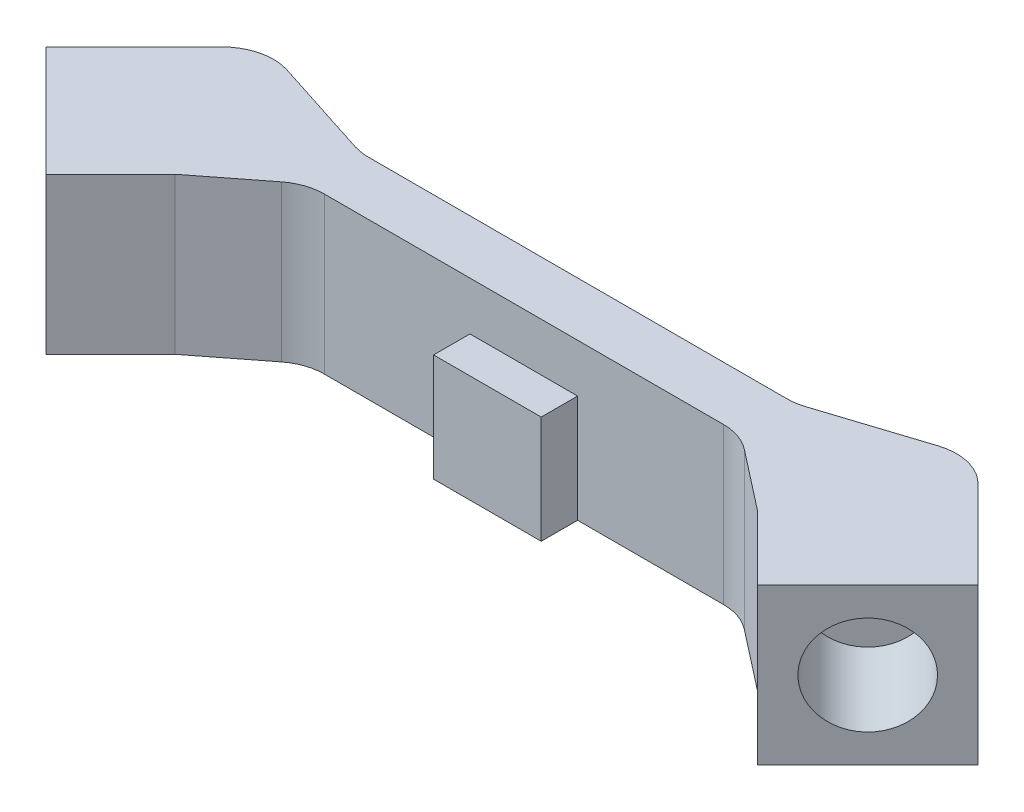
ISO-10303-21;
HEADER;
FILE_DESCRIPTION(('STEP AP214'),'2;1');
FILE_NAME('part.step','',(''),(''),'','','');
FILE_SCHEMA(('AUTOMOTIVE_DESIGN { 1 0 10303 214 1 1 1 1 }'));
ENDSEC;
DATA;
#1=APPLICATION_CONTEXT('core data for automotive mechanical design processes');
#2=APPLICATION_PROTOCOL_DEFINITION('international standard','automotive_design',2000,#1);
#3=PRODUCT_CONTEXT('',#1,'mechanical');
#4=PRODUCT('Part','Part','',(#3));
#5=PRODUCT_RELATED_PRODUCT_CATEGORY('part','',(#4));
#6=PRODUCT_DEFINITION_FORMATION('','',#4);
#7=PRODUCT_DEFINITION_CONTEXT('part definition',#1,'design');
#8=PRODUCT_DEFINITION('design','',#6,#7);
#9=PRODUCT_DEFINITION_SHAPE('','',#8);
#10=(LENGTH_UNIT() NAMED_UNIT(*) SI_UNIT(.MILLI.,.METRE.));
#11=(NAMED_UNIT(*) PLANE_ANGLE_UNIT() SI_UNIT($,.RADIAN.));
#12=(NAMED_UNIT(*) SI_UNIT($,.STERADIAN.) SOLID_ANGLE_UNIT());
#13=UNCERTAINTY_MEASURE_WITH_UNIT(LENGTH_MEASURE(1.E-05),#10,'distance_accuracy_value','');
#14=(GEOMETRIC_REPRESENTATION_CONTEXT(3) GLOBAL_UNCERTAINTY_ASSIGNED_CONTEXT((#13)) GLOBAL_UNIT_ASSIGNED_CONTEXT((#10,
#11,#12)) REPRESENTATION_CONTEXT('',''));
#15=CARTESIAN_POINT('',(0.,0.,0.));
#16=DIRECTION('',(0.,0.,1.));
#17=DIRECTION('',(1.,0.,0.));
#18=AXIS2_PLACEMENT_3D('',#15,#16,#17);
#19=CARTESIAN_POINT('',(22.3728200380593,38.1,-14.0413634793503));
#20=DIRECTION('',(0.,0.,-1.));
#21=DIRECTION('',(-1.,0.,0.));
#22=AXIS2_PLACEMENT_3D('',#19,#20,#21);
#23=PLANE('',#22);
#24=DIRECTION('',(0.,1.,0.));
#25=VECTOR('',#24,1.);
#26=CARTESIAN_POINT('',(84.2645,26.289,-14.0413634793503));
#27=LINE('',#26,#25);
#28=CARTESIAN_POINT('',(84.2645,0.,-14.0413634793503));
#29=VERTEX_POINT('',#28);
#30=CARTESIAN_POINT('',(84.2645,26.289,-14.0413634793503));
#31=VERTEX_POINT('',#30);
#32=EDGE_CURVE('E436',#29,#31,#27,.T.);
#33=ORIENTED_EDGE('',*,*,#32,.F.);
#34=DIRECTION('',(1.,0.,0.));
#35=VECTOR('',#34,1.);
#36=CARTESIAN_POINT('',(22.3728200380593,0.,-14.0413634793503));
#37=LINE('',#36,#35);
#38=CARTESIAN_POINT('',(119.867179961941,0.,-14.0413634793503));
#39=VERTEX_POINT('',#38);
#40=EDGE_CURVE('E219',#29,#39,#37,.T.);
#41=ORIENTED_EDGE('',*,*,#40,.T.);
#42=DIRECTION('',(0.,-1.,0.));
#43=VECTOR('',#42,1.);
#44=CARTESIAN_POINT('',(119.867179961941,38.1,-14.0413634793503));
#45=LINE('',#44,#43);
#46=CARTESIAN_POINT('',(119.867179961941,38.1,-14.0413634793503));
#47=VERTEX_POINT('',#46);
#48=EDGE_CURVE('E413',#47,#39,#45,.T.);
#49=ORIENTED_EDGE('',*,*,#48,.F.);
#50=DIRECTION('',(1.,0.,0.));
#51=VECTOR('',#50,1.);
#52=CARTESIAN_POINT('',(22.3728200380593,38.1,-14.0413634793503));
#53=LINE('',#52,#51);
#54=CARTESIAN_POINT('',(22.3728200380593,38.1,-14.0413634793503));
#55=VERTEX_POINT('',#54);
#56=EDGE_CURVE('E252',#55,#47,#53,.T.);
#57=ORIENTED_EDGE('',*,*,#56,.F.);
#58=DIRECTION('',(0.,-1.,0.));
#59=VECTOR('',#58,1.);
#60=CARTESIAN_POINT('',(22.3728200380593,38.1,-14.0413634793503));
#61=LINE('',#60,#59);
#62=CARTESIAN_POINT('',(22.3728200380593,0.,-14.0413634793503));
#63=VERTEX_POINT('',#62);
#64=EDGE_CURVE('E54',#55,#63,#61,.T.);
#65=ORIENTED_EDGE('',*,*,#64,.T.);
#66=CARTESIAN_POINT('',(57.9755,0.,-14.0413634793503));
#67=VERTEX_POINT('',#66);
#68=EDGE_CURVE('E307',#63,#67,#37,.T.);
#69=ORIENTED_EDGE('',*,*,#68,.T.);
#70=DIRECTION('',(0.,-1.,0.));
#71=VECTOR('',#70,1.);
#72=CARTESIAN_POINT('',(57.9755,0.,-14.0413634793503));
#73=LINE('',#72,#71);
#74=CARTESIAN_POINT('',(57.9755,26.289,-14.0413634793503));
#75=VERTEX_POINT('',#74);
#76=EDGE_CURVE('E66',#75,#67,#73,.T.);
#77=ORIENTED_EDGE('',*,*,#76,.F.);
#78=DIRECTION('',(-1.,0.,0.));
#79=VECTOR('',#78,1.);
#80=CARTESIAN_POINT('',(57.9755,26.289,-14.0413634793503));
#81=LINE('',#80,#79);
#82=EDGE_CURVE('E61',#31,#75,#81,.T.);
#83=ORIENTED_EDGE('',*,*,#82,.F.);
#84=EDGE_LOOP('',(#33,#41,#49,#57,#65,#69,#77,#83));
#85=FACE_BOUND('',#84,.T.);
#86=ADVANCED_FACE('F45',(#85),#23,.F.);
#87=CARTESIAN_POINT('',(14.5631784172701,38.1,-11.356327171488));
#88=DIRECTION('',(-0.614932411085758,0.,-0.788579818278566));
#89=DIRECTION('',(-0.788579818278566,0.,0.614932411085758));
#90=AXIS2_PLACEMENT_3D('',#87,#88,#89);
#91=PLANE('',#90);
#92=DIRECTION('',(0.788579818278566,0.,-0.614932411085758));
#93=VECTOR('',#92,1.);
#94=CARTESIAN_POINT('',(14.5631784172701,0.,-11.356327171488));
#95=LINE('',#94,#93);
#96=CARTESIAN_POINT('',(0.,0.,0.));
#97=VERTEX_POINT('',#96);
#98=CARTESIAN_POINT('',(14.5631784172701,0.,-11.356327171488));
#99=VERTEX_POINT('',#98);
#100=EDGE_CURVE('E240',#97,#99,#95,.T.);
#101=ORIENTED_EDGE('',*,*,#100,.T.);
#102=DIRECTION('',(0.,-1.,0.));
#103=VECTOR('',#102,1.);
#104=CARTESIAN_POINT('',(14.5631784172701,38.1,-11.356327171488));
#105=LINE('',#104,#103);
#106=CARTESIAN_POINT('',(14.5631784172701,38.1,-11.356327171488));
#107=VERTEX_POINT('',#106);
#108=EDGE_CURVE('E11',#107,#99,#105,.T.);
#109=ORIENTED_EDGE('',*,*,#108,.F.);
#110=DIRECTION('',(0.788579818278566,0.,-0.614932411085758));
#111=VECTOR('',#110,1.);
#112=CARTESIAN_POINT('',(14.5631784172701,38.1,-11.356327171488));
#113=LINE('',#112,#111);
#114=CARTESIAN_POINT('',(0.,38.1,0.));
#115=VERTEX_POINT('',#114);
#116=EDGE_CURVE('E244',#115,#107,#113,.T.);
#117=ORIENTED_EDGE('',*,*,#116,.F.);
#118=DIRECTION('',(0.,-1.,0.));
#119=VECTOR('',#118,1.);
#120=CARTESIAN_POINT('',(0.,38.1,0.));
#121=LINE('',#120,#119);
#122=EDGE_CURVE('E300',#115,#97,#121,.T.);
#123=ORIENTED_EDGE('',*,*,#122,.T.);
#124=EDGE_LOOP('',(#101,#109,#117,#123));
#125=FACE_BOUND('',#124,.T.);
#126=ADVANCED_FACE('F47',(#125),#91,.F.);
#127=CARTESIAN_POINT('',(22.3728200380593,38.1,-1.34136347935028));
#128=DIRECTION('',(0.,-1.,0.));
#129=DIRECTION('',(0.,0.,-1.));
#130=AXIS2_PLACEMENT_3D('',#127,#128,#129);
#131=CYLINDRICAL_SURFACE('',#130,12.7);
#132=CARTESIAN_POINT('',(22.3728200380593,0.,-1.34136347935028));
#133=DIRECTION('',(0.,-1.,0.));
#134=DIRECTION('',(0.,0.,1.));
#135=AXIS2_PLACEMENT_3D('',#132,#133,#134);
#136=CIRCLE('',#135,12.7);
#137=EDGE_CURVE('E304',#99,#63,#136,.T.);
#138=ORIENTED_EDGE('',*,*,#137,.T.);
#139=ORIENTED_EDGE('',*,*,#64,.F.);
#140=CARTESIAN_POINT('',(22.3728200380593,38.1,-1.34136347935028));
#141=DIRECTION('',(0.,-1.,0.));
#142=DIRECTION('',(0.,0.,1.));
#143=AXIS2_PLACEMENT_3D('',#140,#141,#142);
#144=CIRCLE('',#143,12.7);
#145=EDGE_CURVE('E248',#107,#55,#144,.T.);
#146=ORIENTED_EDGE('',*,*,#145,.F.);
#147=ORIENTED_EDGE('',*,*,#108,.T.);
#148=EDGE_LOOP('',(#138,#139,#146,#147));
#149=FACE_BOUND('',#148,.T.);
#150=ADVANCED_FACE('F459',(#149),#131,.F.);
#151=CARTESIAN_POINT('',(119.867179961941,38.1,-1.34136347935031));
#152=DIRECTION('',(0.,-1.,0.));
#153=DIRECTION('',(0.,0.,-1.));
#154=AXIS2_PLACEMENT_3D('',#151,#152,#153);
#155=CYLINDRICAL_SURFACE('',#154,12.7);
#156=CARTESIAN_POINT('',(119.867179961941,0.,-1.34136347935031));
#157=DIRECTION('',(0.,-1.,0.));
#158=DIRECTION('',(0.,0.,-1.));
#159=AXIS2_PLACEMENT_3D('',#156,#157,#158);
#160=CIRCLE('',#159,12.7);
#161=CARTESIAN_POINT('',(127.67682158273,0.,-11.3563271714881));
#162=VERTEX_POINT('',#161);
#163=EDGE_CURVE('E310',#39,#162,#160,.T.);
#164=ORIENTED_EDGE('',*,*,#163,.T.);
#165=DIRECTION('',(0.,-1.,0.));
#166=VECTOR('',#165,1.);
#167=CARTESIAN_POINT('',(127.67682158273,38.1,-11.3563271714881));
#168=LINE('',#167,#166);
#169=CARTESIAN_POINT('',(127.67682158273,38.1,-11.3563271714881));
#170=VERTEX_POINT('',#169);
#171=EDGE_CURVE('E409',#170,#162,#168,.T.);
#172=ORIENTED_EDGE('',*,*,#171,.F.);
#173=CARTESIAN_POINT('',(119.867179961941,38.1,-1.34136347935031));
#174=DIRECTION('',(0.,-1.,0.));
#175=DIRECTION('',(0.,0.,-1.));
#176=AXIS2_PLACEMENT_3D('',#173,#174,#175);
#177=CIRCLE('',#176,12.7);
#178=EDGE_CURVE('E255',#47,#170,#177,.T.);
#179=ORIENTED_EDGE('',*,*,#178,.F.);
#180=ORIENTED_EDGE('',*,*,#48,.T.);
#181=EDGE_LOOP('',(#164,#172,#179,#180));
#182=FACE_BOUND('',#181,.T.);
#183=ADVANCED_FACE('F462',(#182),#155,.F.);
#184=CARTESIAN_POINT('',(127.67682158273,38.1,-11.3563271714881));
#185=DIRECTION('',(0.614932411085757,0.,-0.788579818278567));
#186=DIRECTION('',(-0.788579818278567,0.,-0.614932411085757));
#187=AXIS2_PLACEMENT_3D('',#184,#185,#186);
#188=PLANE('',#187);
#189=DIRECTION('',(0.788579818278566,0.,0.614932411085757));
#190=VECTOR('',#189,1.);
#191=CARTESIAN_POINT('',(127.67682158273,0.,-11.3563271714881));
#192=LINE('',#191,#190);
#193=CARTESIAN_POINT('',(142.24,0.,0.));
#194=VERTEX_POINT('',#193);
#195=EDGE_CURVE('E313',#162,#194,#192,.T.);
#196=ORIENTED_EDGE('',*,*,#195,.T.);
#197=DIRECTION('',(0.,-1.,0.));
#198=VECTOR('',#197,1.);
#199=CARTESIAN_POINT('',(142.24,38.1,0.));
#200=LINE('',#199,#198);
#201=CARTESIAN_POINT('',(142.24,38.1,0.));
#202=VERTEX_POINT('',#201);
#203=EDGE_CURVE('E405',#202,#194,#200,.T.);
#204=ORIENTED_EDGE('',*,*,#203,.F.);
#205=DIRECTION('',(0.788579818278566,0.,0.614932411085757));
#206=VECTOR('',#205,1.);
#207=CARTESIAN_POINT('',(127.67682158273,38.1,-11.3563271714881));
#208=LINE('',#207,#206);
#209=EDGE_CURVE('E258',#170,#202,#208,.T.);
#210=ORIENTED_EDGE('',*,*,#209,.F.);
#211=ORIENTED_EDGE('',*,*,#171,.T.);
#212=EDGE_LOOP('',(#196,#204,#210,#211));
#213=FACE_BOUND('',#212,.T.);
#214=ADVANCED_FACE('F468',(#213),#188,.F.);
#215=CARTESIAN_POINT('',(142.24,38.1,0.));
#216=DIRECTION('',(0.707106781186548,0.,-0.707106781186547));
#217=DIRECTION('',(-0.707106781186547,0.,-0.707106781186548));
#218=AXIS2_PLACEMENT_3D('',#215,#216,#217);
#219=PLANE('',#218);
#220=DIRECTION('',(0.707106781186547,0.,0.707106781186548));
#221=VECTOR('',#220,1.);
#222=CARTESIAN_POINT('',(142.24,0.,0.));
#223=LINE('',#222,#221);
#224=CARTESIAN_POINT('',(158.021536726415,0.,15.7815367264148));
#225=VERTEX_POINT('',#224);
#226=EDGE_CURVE('E316',#194,#225,#223,.T.);
#227=ORIENTED_EDGE('',*,*,#226,.T.);
#228=DIRECTION('',(0.,-1.,0.));
#229=VECTOR('',#228,1.);
#230=CARTESIAN_POINT('',(158.021536726415,38.1,15.7815367264148));
#231=LINE('',#230,#229);
#232=CARTESIAN_POINT('',(158.021536726415,38.1,15.7815367264148));
#233=VERTEX_POINT('',#232);
#234=EDGE_CURVE('E401',#233,#225,#231,.T.);
#235=ORIENTED_EDGE('',*,*,#234,.F.);
#236=DIRECTION('',(0.707106781186547,0.,0.707106781186548));
#237=VECTOR('',#236,1.);
#238=CARTESIAN_POINT('',(142.24,38.1,0.));
#239=LINE('',#238,#237);
#240=EDGE_CURVE('E261',#202,#233,#239,.T.);
#241=ORIENTED_EDGE('',*,*,#240,.F.);
#242=ORIENTED_EDGE('',*,*,#203,.T.);
#243=EDGE_LOOP('',(#227,#235,#241,#242));
#244=FACE_BOUND('',#243,.T.);
#245=ADVANCED_FACE('F536',(#244),#219,.F.);
#246=CARTESIAN_POINT('',(184.962305089622,38.1,-11.1592316367926));
#247=DIRECTION('',(-0.707106781186548,0.,-0.707106781186547));
#248=DIRECTION('',(-0.707106781186547,0.,0.707106781186548));
#249=AXIS2_PLACEMENT_3D('',#246,#247,#248);
#250=PLANE('',#249);
#251=CARTESIAN_POINT('',(171.491920908018,19.05,2.31115254481112));
#252=DIRECTION('',(0.707106781186548,0.,0.707106781186547));
#253=DIRECTION('',(0.707106781186547,0.,-0.707106781186548));
#254=AXIS2_PLACEMENT_3D('',#251,#252,#253);
#255=CIRCLE('',#254,12.065);
#256=CARTESIAN_POINT('',(180.023164223034,19.05,-6.22009077020459));
#257=VERTEX_POINT('',#256);
#258=EDGE_CURVE('E221',#257,#257,#255,.T.);
#259=ORIENTED_EDGE('',*,*,#258,.F.);
#260=EDGE_LOOP('',(#259));
#261=FACE_BOUND('',#260,.T.);
#262=DIRECTION('',(0.707106781186547,0.,-0.707106781186548));
#263=VECTOR('',#262,1.);
#264=CARTESIAN_POINT('',(184.962305089622,0.,-11.1592316367926));
#265=LINE('',#264,#263);
#266=CARTESIAN_POINT('',(184.962305089622,0.,-11.1592316367926));
#267=VERTEX_POINT('',#266);
#268=EDGE_CURVE('E319',#225,#267,#265,.T.);
#269=ORIENTED_EDGE('',*,*,#268,.T.);
#270=DIRECTION('',(0.,-1.,0.));
#271=VECTOR('',#270,1.);
#272=CARTESIAN_POINT('',(184.962305089622,38.1,-11.1592316367926));
#273=LINE('',#272,#271);
#274=CARTESIAN_POINT('',(184.962305089622,38.1,-11.1592316367926));
#275=VERTEX_POINT('',#274);
#276=EDGE_CURVE('E397',#275,#267,#273,.T.);
#277=ORIENTED_EDGE('',*,*,#276,.F.);
#278=DIRECTION('',(0.707106781186547,0.,-0.707106781186548));
#279=VECTOR('',#278,1.);
#280=CARTESIAN_POINT('',(184.962305089622,38.1,-11.1592316367926));
#281=LINE('',#280,#279);
#282=EDGE_CURVE('E264',#233,#275,#281,.T.);
#283=ORIENTED_EDGE('',*,*,#282,.F.);
#284=ORIENTED_EDGE('',*,*,#234,.T.);
#285=EDGE_LOOP('',(#269,#277,#283,#284));
#286=FACE_BOUND('',#285,.T.);
#287=ADVANCED_FACE('F531',(#261,#286),#250,.F.);
#288=CARTESIAN_POINT('',(163.508903940708,38.1,-32.6126327857065));
#289=DIRECTION('',(-0.707106781186545,0.,0.70710678118655));
#290=DIRECTION('',(0.70710678118655,0.,0.707106781186545));
#291=AXIS2_PLACEMENT_3D('',#288,#289,#290);
#292=PLANE('',#291);
#293=DIRECTION('',(-0.70710678118655,0.,-0.707106781186545));
#294=VECTOR('',#293,1.);
#295=CARTESIAN_POINT('',(163.508903940708,0.,-32.6126327857065));
#296=LINE('',#295,#294);
#297=CARTESIAN_POINT('',(163.508903940708,0.,-32.6126327857064));
#298=VERTEX_POINT('',#297);
#299=EDGE_CURVE('E322',#267,#298,#296,.T.);
#300=ORIENTED_EDGE('',*,*,#299,.T.);
#301=DIRECTION('',(0.,-1.,0.));
#302=VECTOR('',#301,1.);
#303=CARTESIAN_POINT('',(163.508903940708,38.1,-32.6126327857064));
#304=LINE('',#303,#302);
#305=CARTESIAN_POINT('',(163.508903940708,38.1,-32.6126327857064));
#306=VERTEX_POINT('',#305);
#307=EDGE_CURVE('E393',#306,#298,#304,.T.);
#308=ORIENTED_EDGE('',*,*,#307,.F.);
#309=DIRECTION('',(-0.70710678118655,0.,-0.707106781186545));
#310=VECTOR('',#309,1.);
#311=CARTESIAN_POINT('',(163.508903940708,38.1,-32.6126327857065));
#312=LINE('',#311,#310);
#313=EDGE_CURVE('E267',#275,#306,#312,.T.);
#314=ORIENTED_EDGE('',*,*,#313,.F.);
#315=ORIENTED_EDGE('',*,*,#276,.T.);
#316=EDGE_LOOP('',(#300,#308,#314,#315));
#317=FACE_BOUND('',#316,.T.);
#318=ADVANCED_FACE('F527',(#317),#292,.F.);
#319=CARTESIAN_POINT('',(154.528647819639,38.1,-23.6323766646374));
#320=DIRECTION('',(0.,-1.,0.));
#321=DIRECTION('',(0.,0.,-1.));
#322=AXIS2_PLACEMENT_3D('',#319,#320,#321);
#323=CYLINDRICAL_SURFACE('',#322,12.6999999999999);
#324=CARTESIAN_POINT('',(154.528647819639,0.,-23.6323766646374));
#325=DIRECTION('',(0.,1.,0.));
#326=DIRECTION('',(0.,0.,1.));
#327=AXIS2_PLACEMENT_3D('',#324,#325,#326);
#328=CIRCLE('',#327,12.6999999999999);
#329=CARTESIAN_POINT('',(150.63495170282,0.,-35.7207649174138));
#330=VERTEX_POINT('',#329);
#331=EDGE_CURVE('E325',#298,#330,#328,.T.);
#332=ORIENTED_EDGE('',*,*,#331,.T.);
#333=DIRECTION('',(0.,-1.,0.));
#334=VECTOR('',#333,1.);
#335=CARTESIAN_POINT('',(150.63495170282,38.1,-35.7207649174138));
#336=LINE('',#335,#334);
#337=CARTESIAN_POINT('',(150.63495170282,38.1,-35.7207649174138));
#338=VERTEX_POINT('',#337);
#339=EDGE_CURVE('E389',#338,#330,#336,.T.);
#340=ORIENTED_EDGE('',*,*,#339,.F.);
#341=CARTESIAN_POINT('',(154.528647819639,38.1,-23.6323766646374));
#342=DIRECTION('',(0.,1.,0.));
#343=DIRECTION('',(0.,0.,1.));
#344=AXIS2_PLACEMENT_3D('',#341,#342,#343);
#345=CIRCLE('',#344,12.6999999999999);
#346=EDGE_CURVE('E270',#306,#338,#345,.T.);
#347=ORIENTED_EDGE('',*,*,#346,.F.);
#348=ORIENTED_EDGE('',*,*,#307,.T.);
#349=EDGE_LOOP('',(#332,#340,#347,#348));
#350=FACE_BOUND('',#349,.T.);
#351=ADVANCED_FACE('F522',(#350),#323,.T.);
#352=CARTESIAN_POINT('',(150.63495170282,38.1,-35.7207649174138));
#353=DIRECTION('',(0.306590245418851,0.,0.951841594706813));
#354=DIRECTION('',(0.951841594706813,0.,-0.306590245418851));
#355=AXIS2_PLACEMENT_3D('',#352,#353,#354);
#356=PLANE('',#355);
#357=DIRECTION('',(-0.951841594706813,0.,0.306590245418851));
#358=VECTOR('',#357,1.);
#359=CARTESIAN_POINT('',(150.63495170282,0.,-35.7207649174138));
#360=LINE('',#359,#358);
#361=CARTESIAN_POINT('',(126.132385387354,0.,-27.8284350782622));
#362=VERTEX_POINT('',#361);
#363=EDGE_CURVE('E328',#330,#362,#360,.T.);
#364=ORIENTED_EDGE('',*,*,#363,.T.);
#365=DIRECTION('',(0.,-1.,0.));
#366=VECTOR('',#365,1.);
#367=CARTESIAN_POINT('',(126.132385387354,38.1,-27.8284350782622));
#368=LINE('',#367,#366);
#369=CARTESIAN_POINT('',(126.132385387354,38.1,-27.8284350782622));
#370=VERTEX_POINT('',#369);
#371=EDGE_CURVE('E385',#370,#362,#368,.T.);
#372=ORIENTED_EDGE('',*,*,#371,.F.);
#373=DIRECTION('',(-0.951841594706813,0.,0.306590245418851));
#374=VECTOR('',#373,1.);
#375=CARTESIAN_POINT('',(150.63495170282,38.1,-35.7207649174138));
#376=LINE('',#375,#374);
#377=EDGE_CURVE('E273',#338,#370,#376,.T.);
#378=ORIENTED_EDGE('',*,*,#377,.F.);
#379=ORIENTED_EDGE('',*,*,#339,.T.);
#380=EDGE_LOOP('',(#364,#372,#378,#379));
#381=FACE_BOUND('',#380,.T.);
#382=ADVANCED_FACE('F516',(#381),#356,.F.);
#383=CARTESIAN_POINT('',(122.238689270535,38.1,-39.9168233310395));
#384=DIRECTION('',(0.,-1.,0.));
#385=DIRECTION('',(0.,0.,-1.));
#386=AXIS2_PLACEMENT_3D('',#383,#384,#385);
#387=CYLINDRICAL_SURFACE('',#386,12.7000000000007);
#388=CARTESIAN_POINT('',(122.238689270535,0.,-39.9168233310395));
#389=DIRECTION('',(0.,-1.,0.));
#390=DIRECTION('',(0.,0.,-1.));
#391=AXIS2_PLACEMENT_3D('',#388,#389,#390);
#392=CIRCLE('',#391,12.7000000000007);
#393=CARTESIAN_POINT('',(122.238689270535,0.,-27.2168233310388));
#394=VERTEX_POINT('',#393);
#395=EDGE_CURVE('E331',#362,#394,#392,.T.);
#396=ORIENTED_EDGE('',*,*,#395,.T.);
#397=DIRECTION('',(0.,-1.,0.));
#398=VECTOR('',#397,1.);
#399=CARTESIAN_POINT('',(122.238689270535,38.1,-27.2168233310388));
#400=LINE('',#399,#398);
#401=CARTESIAN_POINT('',(122.238689270535,38.1,-27.2168233310388));
#402=VERTEX_POINT('',#401);
#403=EDGE_CURVE('E381',#402,#394,#400,.T.);
#404=ORIENTED_EDGE('',*,*,#403,.F.);
#405=CARTESIAN_POINT('',(122.238689270535,38.1,-39.9168233310395));
#406=DIRECTION('',(0.,-1.,0.));
#407=DIRECTION('',(0.,0.,-1.));
#408=AXIS2_PLACEMENT_3D('',#405,#406,#407);
#409=CIRCLE('',#408,12.7000000000007);
#410=EDGE_CURVE('E276',#370,#402,#409,.T.);
#411=ORIENTED_EDGE('',*,*,#410,.F.);
#412=ORIENTED_EDGE('',*,*,#371,.T.);
#413=EDGE_LOOP('',(#396,#404,#411,#412));
#414=FACE_BOUND('',#413,.T.);
#415=ADVANCED_FACE('F512',(#414),#387,.F.);
#416=CARTESIAN_POINT('',(20.0013107294649,38.1,-27.2168233310385));
#417=DIRECTION('',(0.,0.,1.));
#418=DIRECTION('',(1.,0.,0.));
#419=AXIS2_PLACEMENT_3D('',#416,#417,#418);
#420=PLANE('',#419);
#421=DIRECTION('',(-1.,0.,0.));
#422=VECTOR('',#421,1.);
#423=CARTESIAN_POINT('',(20.0013107294649,0.,-27.2168233310385));
#424=LINE('',#423,#422);
#425=CARTESIAN_POINT('',(20.0013107294651,0.,-27.2168233310384));
#426=VERTEX_POINT('',#425);
#427=EDGE_CURVE('E334',#394,#426,#424,.T.);
#428=ORIENTED_EDGE('',*,*,#427,.T.);
#429=DIRECTION('',(0.,-1.,0.));
#430=VECTOR('',#429,1.);
#431=CARTESIAN_POINT('',(20.0013107294651,38.1,-27.2168233310384));
#432=LINE('',#431,#430);
#433=CARTESIAN_POINT('',(20.0013107294651,38.1,-27.2168233310384));
#434=VERTEX_POINT('',#433);
#435=EDGE_CURVE('E377',#434,#426,#432,.T.);
#436=ORIENTED_EDGE('',*,*,#435,.F.);
#437=DIRECTION('',(-1.,0.,0.));
#438=VECTOR('',#437,1.);
#439=CARTESIAN_POINT('',(20.0013107294649,38.1,-27.2168233310385));
#440=LINE('',#439,#438);
#441=EDGE_CURVE('E279',#402,#434,#440,.T.);
#442=ORIENTED_EDGE('',*,*,#441,.F.);
#443=ORIENTED_EDGE('',*,*,#403,.T.);
#444=EDGE_LOOP('',(#428,#436,#442,#443));
#445=FACE_BOUND('',#444,.T.);
#446=ADVANCED_FACE('F507',(#445),#420,.F.);
#447=CARTESIAN_POINT('',(20.0013107294651,38.1,-39.9168233310395));
#448=DIRECTION('',(0.,-1.,0.));
#449=DIRECTION('',(0.,0.,-1.));
#450=AXIS2_PLACEMENT_3D('',#447,#448,#449);
#451=CYLINDRICAL_SURFACE('',#450,12.7000000000011);
#452=CARTESIAN_POINT('',(20.0013107294651,0.,-39.9168233310395));
#453=DIRECTION('',(0.,-1.,0.));
#454=DIRECTION('',(0.,0.,1.));
#455=AXIS2_PLACEMENT_3D('',#452,#453,#454);
#456=CIRCLE('',#455,12.7000000000011);
#457=CARTESIAN_POINT('',(16.1076146126453,0.,-27.828435078262));
#458=VERTEX_POINT('',#457);
#459=EDGE_CURVE('E337',#426,#458,#456,.T.);
#460=ORIENTED_EDGE('',*,*,#459,.T.);
#461=DIRECTION('',(0.,-1.,0.));
#462=VECTOR('',#461,1.);
#463=CARTESIAN_POINT('',(16.1076146126453,38.1,-27.828435078262));
#464=LINE('',#463,#462);
#465=CARTESIAN_POINT('',(16.1076146126453,38.1,-27.828435078262));
#466=VERTEX_POINT('',#465);
#467=EDGE_CURVE('E373',#466,#458,#464,.T.);
#468=ORIENTED_EDGE('',*,*,#467,.F.);
#469=CARTESIAN_POINT('',(20.0013107294651,38.1,-39.9168233310395));
#470=DIRECTION('',(0.,-1.,0.));
#471=DIRECTION('',(0.,0.,1.));
#472=AXIS2_PLACEMENT_3D('',#469,#470,#471);
#473=CIRCLE('',#472,12.7000000000011);
#474=EDGE_CURVE('E282',#434,#466,#473,.T.);
#475=ORIENTED_EDGE('',*,*,#474,.F.);
#476=ORIENTED_EDGE('',*,*,#435,.T.);
#477=EDGE_LOOP('',(#460,#468,#475,#476));
#478=FACE_BOUND('',#477,.T.);
#479=ADVANCED_FACE('F501',(#478),#451,.F.);
#480=CARTESIAN_POINT('',(-8.39495170281962,38.1,-35.7207649174137));
#481=DIRECTION('',(-0.306590245418861,0.,0.95184159470681));
#482=DIRECTION('',(0.95184159470681,0.,0.306590245418861));
#483=AXIS2_PLACEMENT_3D('',#480,#481,#482);
#484=PLANE('',#483);
#485=DIRECTION('',(-0.95184159470681,0.,-0.306590245418861));
#486=VECTOR('',#485,1.);
#487=CARTESIAN_POINT('',(-8.39495170281962,0.,-35.7207649174137));
#488=LINE('',#487,#486);
#489=CARTESIAN_POINT('',(-8.39495170281958,0.,-35.7207649174138));
#490=VERTEX_POINT('',#489);
#491=EDGE_CURVE('E340',#458,#490,#488,.T.);
#492=ORIENTED_EDGE('',*,*,#491,.T.);
#493=DIRECTION('',(0.,-1.,0.));
#494=VECTOR('',#493,1.);
#495=CARTESIAN_POINT('',(-8.39495170281958,38.1,-35.7207649174138));
#496=LINE('',#495,#494);
#497=CARTESIAN_POINT('',(-8.39495170281958,38.1,-35.7207649174138));
#498=VERTEX_POINT('',#497);
#499=EDGE_CURVE('E369',#498,#490,#496,.T.);
#500=ORIENTED_EDGE('',*,*,#499,.F.);
#501=DIRECTION('',(-0.95184159470681,0.,-0.306590245418861));
#502=VECTOR('',#501,1.);
#503=CARTESIAN_POINT('',(-8.39495170281962,38.1,-35.7207649174137));
#504=LINE('',#503,#502);
#505=EDGE_CURVE('E285',#466,#498,#504,.T.);
#506=ORIENTED_EDGE('',*,*,#505,.F.);
#507=ORIENTED_EDGE('',*,*,#467,.T.);
#508=EDGE_LOOP('',(#492,#500,#506,#507));
#509=FACE_BOUND('',#508,.T.);
#510=ADVANCED_FACE('F497',(#509),#484,.F.);
#511=CARTESIAN_POINT('',(-12.2886478196389,38.1,-23.6323766646374));
#512=DIRECTION('',(0.,-1.,0.));
#513=DIRECTION('',(0.,0.,-1.));
#514=AXIS2_PLACEMENT_3D('',#511,#512,#513);
#515=CYLINDRICAL_SURFACE('',#514,12.6999999999999);
#516=CARTESIAN_POINT('',(-12.2886478196389,0.,-23.6323766646374));
#517=DIRECTION('',(0.,1.,0.));
#518=DIRECTION('',(0.,0.,-1.));
#519=AXIS2_PLACEMENT_3D('',#516,#517,#518);
#520=CIRCLE('',#519,12.6999999999999);
#521=CARTESIAN_POINT('',(-21.2689039407083,0.,-32.6126327857064));
#522=VERTEX_POINT('',#521);
#523=EDGE_CURVE('E343',#490,#522,#520,.T.);
#524=ORIENTED_EDGE('',*,*,#523,.T.);
#525=DIRECTION('',(0.,-1.,0.));
#526=VECTOR('',#525,1.);
#527=CARTESIAN_POINT('',(-21.2689039407083,38.1,-32.6126327857064));
#528=LINE('',#527,#526);
#529=CARTESIAN_POINT('',(-21.2689039407083,38.1,-32.6126327857064));
#530=VERTEX_POINT('',#529);
#531=EDGE_CURVE('E365',#530,#522,#528,.T.);
#532=ORIENTED_EDGE('',*,*,#531,.F.);
#533=CARTESIAN_POINT('',(-12.2886478196389,38.1,-23.6323766646374));
#534=DIRECTION('',(0.,1.,0.));
#535=DIRECTION('',(0.,0.,-1.));
#536=AXIS2_PLACEMENT_3D('',#533,#534,#535);
#537=CIRCLE('',#536,12.6999999999999);
#538=EDGE_CURVE('E288',#498,#530,#537,.T.);
#539=ORIENTED_EDGE('',*,*,#538,.F.);
#540=ORIENTED_EDGE('',*,*,#499,.T.);
#541=EDGE_LOOP('',(#524,#532,#539,#540));
#542=FACE_BOUND('',#541,.T.);
#543=ADVANCED_FACE('F492',(#542),#515,.T.);
#544=CARTESIAN_POINT('',(-21.2689039407083,38.1,-32.6126327857064));
#545=DIRECTION('',(0.707106781186545,0.,0.70710678118655));
#546=DIRECTION('',(0.70710678118655,0.,-0.707106781186545));
#547=AXIS2_PLACEMENT_3D('',#544,#545,#546);
#548=PLANE('',#547);
#549=DIRECTION('',(-0.70710678118655,0.,0.707106781186545));
#550=VECTOR('',#549,1.);
#551=CARTESIAN_POINT('',(-21.2689039407083,0.,-32.6126327857064));
#552=LINE('',#551,#550);
#553=CARTESIAN_POINT('',(-42.7223050896222,0.,-11.1592316367926));
#554=VERTEX_POINT('',#553);
#555=EDGE_CURVE('E346',#522,#554,#552,.T.);
#556=ORIENTED_EDGE('',*,*,#555,.T.);
#557=DIRECTION('',(0.,-1.,0.));
#558=VECTOR('',#557,1.);
#559=CARTESIAN_POINT('',(-42.7223050896222,38.1,-11.1592316367926));
#560=LINE('',#559,#558);
#561=CARTESIAN_POINT('',(-42.7223050896222,38.1,-11.1592316367926));
#562=VERTEX_POINT('',#561);
#563=EDGE_CURVE('E361',#562,#554,#560,.T.);
#564=ORIENTED_EDGE('',*,*,#563,.F.);
#565=DIRECTION('',(-0.70710678118655,0.,0.707106781186545));
#566=VECTOR('',#565,1.);
#567=CARTESIAN_POINT('',(-21.2689039407083,38.1,-32.6126327857064));
#568=LINE('',#567,#566);
#569=EDGE_CURVE('E291',#530,#562,#568,.T.);
#570=ORIENTED_EDGE('',*,*,#569,.F.);
#571=ORIENTED_EDGE('',*,*,#531,.T.);
#572=EDGE_LOOP('',(#556,#564,#570,#571));
#573=FACE_BOUND('',#572,.T.);
#574=ADVANCED_FACE('F486',(#573),#548,.F.);
#575=CARTESIAN_POINT('',(-42.7223050896222,38.1,-11.1592316367926));
#576=DIRECTION('',(0.707106781186548,0.,-0.707106781186548));
#577=DIRECTION('',(-0.707106781186548,0.,-0.707106781186548));
#578=AXIS2_PLACEMENT_3D('',#575,#576,#577);
#579=PLANE('',#578);
#580=CARTESIAN_POINT('',(-29.2519209080186,19.05,2.31115254481109));
#581=DIRECTION('',(-0.707106781186547,0.,0.707106781186548));
#582=DIRECTION('',(0.707106781186548,0.,0.707106781186547));
#583=AXIS2_PLACEMENT_3D('',#580,#581,#582);
#584=CIRCLE('',#583,12.065);
#585=CARTESIAN_POINT('',(-20.7206775930028,19.05,10.8423958598268));
#586=VERTEX_POINT('',#585);
#587=EDGE_CURVE('E234',#586,#586,#584,.T.);
#588=ORIENTED_EDGE('',*,*,#587,.F.);
#589=EDGE_LOOP('',(#588));
#590=FACE_BOUND('',#589,.T.);
#591=DIRECTION('',(0.707106781186548,0.,0.707106781186548));
#592=VECTOR('',#591,1.);
#593=CARTESIAN_POINT('',(-42.7223050896222,0.,-11.1592316367926));
#594=LINE('',#593,#592);
#595=CARTESIAN_POINT('',(-15.7815367264148,0.,15.7815367264148));
#596=VERTEX_POINT('',#595);
#597=EDGE_CURVE('E349',#554,#596,#594,.T.);
#598=ORIENTED_EDGE('',*,*,#597,.T.);
#599=DIRECTION('',(0.,-1.,0.));
#600=VECTOR('',#599,1.);
#601=CARTESIAN_POINT('',(-15.7815367264148,38.1,15.7815367264148));
#602=LINE('',#601,#600);
#603=CARTESIAN_POINT('',(-15.7815367264148,38.1,15.7815367264148));
#604=VERTEX_POINT('',#603);
#605=EDGE_CURVE('E357',#604,#596,#602,.T.);
#606=ORIENTED_EDGE('',*,*,#605,.F.);
#607=DIRECTION('',(0.707106781186548,0.,0.707106781186548));
#608=VECTOR('',#607,1.);
#609=CARTESIAN_POINT('',(-42.7223050896222,38.1,-11.1592316367926));
#610=LINE('',#609,#608);
#611=EDGE_CURVE('E294',#562,#604,#610,.T.);
#612=ORIENTED_EDGE('',*,*,#611,.F.);
#613=ORIENTED_EDGE('',*,*,#563,.T.);
#614=EDGE_LOOP('',(#598,#606,#612,#613));
#615=FACE_BOUND('',#614,.T.);
#616=ADVANCED_FACE('F482',(#590,#615),#579,.F.);
#617=CARTESIAN_POINT('',(0.,38.1,0.));
#618=DIRECTION('',(-0.707106781186549,0.,-0.707106781186546));
#619=DIRECTION('',(-0.707106781186546,0.,0.707106781186549));
#620=AXIS2_PLACEMENT_3D('',#617,#618,#619);
#621=PLANE('',#620);
#622=DIRECTION('',(0.707106781186546,0.,-0.707106781186549));
#623=VECTOR('',#622,1.);
#624=CARTESIAN_POINT('',(0.,0.,0.));
#625=LINE('',#624,#623);
#626=EDGE_CURVE('E249',#596,#97,#625,.T.);
#627=ORIENTED_EDGE('',*,*,#626,.T.);
#628=ORIENTED_EDGE('',*,*,#122,.F.);
#629=DIRECTION('',(0.707106781186546,0.,-0.707106781186549));
#630=VECTOR('',#629,1.);
#631=CARTESIAN_POINT('',(0.,38.1,0.));
#632=LINE('',#631,#630);
#633=EDGE_CURVE('E297',#604,#115,#632,.T.);
#634=ORIENTED_EDGE('',*,*,#633,.F.);
#635=ORIENTED_EDGE('',*,*,#605,.T.);
#636=EDGE_LOOP('',(#627,#628,#634,#635));
#637=FACE_BOUND('',#636,.T.);
#638=ADVANCED_FACE('F477',(#637),#621,.F.);
#639=CARTESIAN_POINT('',(-12.2886478196389,38.1,-23.6323766646374));
#640=DIRECTION('',(0.,-1.,0.));
#641=DIRECTION('',(0.,0.,-1.));
#642=AXIS2_PLACEMENT_3D('',#639,#640,#641);
#643=PLANE('',#642);
#644=ORIENTED_EDGE('',*,*,#116,.T.);
#645=ORIENTED_EDGE('',*,*,#145,.T.);
#646=ORIENTED_EDGE('',*,*,#56,.T.);
#647=ORIENTED_EDGE('',*,*,#178,.T.);
#648=ORIENTED_EDGE('',*,*,#209,.T.);
#649=ORIENTED_EDGE('',*,*,#240,.T.);
#650=ORIENTED_EDGE('',*,*,#282,.T.);
#651=ORIENTED_EDGE('',*,*,#313,.T.);
#652=ORIENTED_EDGE('',*,*,#346,.T.);
#653=ORIENTED_EDGE('',*,*,#377,.T.);
#654=ORIENTED_EDGE('',*,*,#410,.T.);
#655=ORIENTED_EDGE('',*,*,#441,.T.);
#656=ORIENTED_EDGE('',*,*,#474,.T.);
#657=ORIENTED_EDGE('',*,*,#505,.T.);
#658=ORIENTED_EDGE('',*,*,#538,.T.);
#659=ORIENTED_EDGE('',*,*,#569,.T.);
#660=ORIENTED_EDGE('',*,*,#611,.T.);
#661=ORIENTED_EDGE('',*,*,#633,.T.);
#662=EDGE_LOOP('',(#644,#645,#646,#647,#648,#649,#650,#651,#652,#653,#654,#655,#656,#657,#658,
#659,#660,#661));
#663=FACE_BOUND('',#662,.T.);
#664=ADVANCED_FACE('F545',(#663),#643,.F.);
#665=CARTESIAN_POINT('',(-12.2886478196389,0.,-23.6323766646374));
#666=DIRECTION('',(0.,-1.,0.));
#667=DIRECTION('',(0.,0.,-1.));
#668=AXIS2_PLACEMENT_3D('',#665,#666,#667);
#669=PLANE('',#668);
#670=ORIENTED_EDGE('',*,*,#100,.F.);
#671=ORIENTED_EDGE('',*,*,#626,.F.);
#672=ORIENTED_EDGE('',*,*,#597,.F.);
#673=ORIENTED_EDGE('',*,*,#555,.F.);
#674=ORIENTED_EDGE('',*,*,#523,.F.);
#675=ORIENTED_EDGE('',*,*,#491,.F.);
#676=ORIENTED_EDGE('',*,*,#459,.F.);
#677=ORIENTED_EDGE('',*,*,#427,.F.);
#678=ORIENTED_EDGE('',*,*,#395,.F.);
#679=ORIENTED_EDGE('',*,*,#363,.F.);
#680=ORIENTED_EDGE('',*,*,#331,.F.);
#681=ORIENTED_EDGE('',*,*,#299,.F.);
#682=ORIENTED_EDGE('',*,*,#268,.F.);
#683=ORIENTED_EDGE('',*,*,#226,.F.);
#684=ORIENTED_EDGE('',*,*,#195,.F.);
#685=ORIENTED_EDGE('',*,*,#163,.F.);
#686=ORIENTED_EDGE('',*,*,#40,.F.);
#687=DIRECTION('',(0.,0.,-1.));
#688=VECTOR('',#687,1.);
#689=CARTESIAN_POINT('',(84.2645,0.,-5.15136347935028));
#690=LINE('',#689,#688);
#691=CARTESIAN_POINT('',(84.2645,0.,-5.15136347935028));
#692=VERTEX_POINT('',#691);
#693=EDGE_CURVE('E198',#692,#29,#690,.T.);
#694=ORIENTED_EDGE('',*,*,#693,.F.);
#695=DIRECTION('',(1.,0.,0.));
#696=VECTOR('',#695,1.);
#697=CARTESIAN_POINT('',(57.9755,0.,-5.15136347935028));
#698=LINE('',#697,#696);
#699=CARTESIAN_POINT('',(57.9755,0.,-5.15136347935028));
#700=VERTEX_POINT('',#699);
#701=EDGE_CURVE('E205',#700,#692,#698,.T.);
#702=ORIENTED_EDGE('',*,*,#701,.F.);
#703=DIRECTION('',(0.,0.,-1.));
#704=VECTOR('',#703,1.);
#705=CARTESIAN_POINT('',(57.9755,0.,-5.15136347935028));
#706=LINE('',#705,#704);
#707=EDGE_CURVE('E423',#700,#67,#706,.T.);
#708=ORIENTED_EDGE('',*,*,#707,.T.);
#709=ORIENTED_EDGE('',*,*,#68,.F.);
#710=ORIENTED_EDGE('',*,*,#137,.F.);
#711=EDGE_LOOP('',(#670,#671,#672,#673,#674,#675,#676,#677,#678,#679,#680,#681,#682,#683,#684,
#685,#686,#694,#702,#708,#709,#710));
#712=FACE_BOUND('',#711,.T.);
#713=ADVANCED_FACE('F217',(#712),#669,.T.);
#714=CARTESIAN_POINT('',(-11.2914086658802,19.05,-15.6493596973272));
#715=DIRECTION('',(-0.707106781186547,0.,0.707106781186548));
#716=DIRECTION('',(0.707106781186548,0.,0.707106781186547));
#717=AXIS2_PLACEMENT_3D('',#714,#715,#716);
#718=CYLINDRICAL_SURFACE('',#717,12.065);
#719=CARTESIAN_POINT('',(-11.2914086658802,19.05,-15.6493596973272));
#720=DIRECTION('',(-0.707106781186547,0.,0.707106781186548));
#721=DIRECTION('',(0.707106781186548,0.,0.707106781186547));
#722=AXIS2_PLACEMENT_3D('',#719,#720,#721);
#723=CIRCLE('',#722,12.065);
#724=CARTESIAN_POINT('',(-2.76016535086455,19.05,-7.11811638231153));
#725=VERTEX_POINT('',#724);
#726=EDGE_CURVE('E236',#725,#725,#723,.T.);
#727=CARTESIAN_POINT('',(-2.76016535086455,19.05,-7.11811638231153));
#728=CARTESIAN_POINT('',(-2.94725402005349,19.05,-6.93102771312259));
#729=CARTESIAN_POINT('',(-3.13434268924243,19.05,-6.74393904393365));
#730=CARTESIAN_POINT('',(-3.50852002762031,19.05,-6.36976170555577));
#731=CARTESIAN_POINT('',(-3.69560869680925,19.05,-6.18267303636683));
#732=CARTESIAN_POINT('',(-4.06978603518713,19.05,-5.80849569798894));
#733=CARTESIAN_POINT('',(-4.25687470437607,19.05,-5.6214070288));
#734=CARTESIAN_POINT('',(-4.63105204275395,19.05,-5.24722969042212));
#735=CARTESIAN_POINT('',(-4.81814071194289,19.05,-5.06014102123318));
#736=CARTESIAN_POINT('',(-5.19231805032078,19.05,-4.6859636828553));
#737=CARTESIAN_POINT('',(-5.37940671950972,19.05,-4.49887501366636));
#738=CARTESIAN_POINT('',(-5.7535840578876,19.05,-4.12469767528848));
#739=CARTESIAN_POINT('',(-5.94067272707654,19.05,-3.93760900609954));
#740=CARTESIAN_POINT('',(-6.31485006545442,19.05,-3.56343166772165));
#741=CARTESIAN_POINT('',(-6.50193873464336,19.05,-3.37634299853271));
#742=CARTESIAN_POINT('',(-6.87611607302124,19.05,-3.00216566015483));
#743=CARTESIAN_POINT('',(-7.06320474221018,19.05,-2.81507699096589));
#744=CARTESIAN_POINT('',(-7.43738208058806,19.05,-2.44089965258801));
#745=CARTESIAN_POINT('',(-7.624470749777,19.05,-2.25381098339907));
#746=CARTESIAN_POINT('',(-7.99864808815489,19.05,-1.87963364502119));
#747=CARTESIAN_POINT('',(-8.18573675734383,19.05,-1.69254497583225));
#748=CARTESIAN_POINT('',(-8.55991409572171,19.05,-1.31836763745437));
#749=CARTESIAN_POINT('',(-8.74700276491065,19.05,-1.13127896826543));
#750=CARTESIAN_POINT('',(-9.12118010328853,19.05,-0.757101629887544));
#751=CARTESIAN_POINT('',(-9.30826877247747,19.05,-0.570012960698604));
#752=CARTESIAN_POINT('',(-9.68244611085535,19.05,-0.195835622320723));
#753=CARTESIAN_POINT('',(-9.86953478004429,19.05,-0.00874695313178098));
#754=CARTESIAN_POINT('',(-10.2437121184222,19.05,0.365430385246101));
#755=CARTESIAN_POINT('',(-10.4308007876111,19.05,0.552519054435041));
#756=CARTESIAN_POINT('',(-10.804978125989,19.05,0.926696392812923));
#757=CARTESIAN_POINT('',(-10.9920667951779,19.05,1.11378506200186));
#758=CARTESIAN_POINT('',(-11.3662441335558,19.05,1.48796240037975));
#759=CARTESIAN_POINT('',(-11.5533328027448,19.05,1.67505106956869));
#760=CARTESIAN_POINT('',(-11.9275101411226,19.05,2.04922840794657));
#761=CARTESIAN_POINT('',(-12.1145988103116,19.05,2.23631707713551));
#762=CARTESIAN_POINT('',(-12.4887761486895,19.05,2.61049441551339));
#763=CARTESIAN_POINT('',(-12.6758648178784,19.05,2.79758308470233));
#764=CARTESIAN_POINT('',(-13.0500421562563,19.05,3.17176042308021));
#765=CARTESIAN_POINT('',(-13.2371308254452,19.05,3.35884909226915));
#766=CARTESIAN_POINT('',(-13.6113081638231,19.05,3.73302643064703));
#767=CARTESIAN_POINT('',(-13.798396833012,19.05,3.92011509983597));
#768=CARTESIAN_POINT('',(-14.1725741713899,19.05,4.29429243821386));
#769=CARTESIAN_POINT('',(-14.3596628405789,19.05,4.4813811074028));
#770=CARTESIAN_POINT('',(-14.7338401789568,19.05,4.85555844578068));
#771=CARTESIAN_POINT('',(-14.9209288481457,19.05,5.04264711496962));
#772=CARTESIAN_POINT('',(-15.2951061865236,19.05,5.4168244533475));
#773=CARTESIAN_POINT('',(-15.4821948557125,19.05,5.60391312253644));
#774=CARTESIAN_POINT('',(-15.8563721940904,19.05,5.97809046091432));
#775=CARTESIAN_POINT('',(-16.0434608632793,19.05,6.16517913010326));
#776=CARTESIAN_POINT('',(-16.4176382016572,19.05,6.53935646848114));
#777=CARTESIAN_POINT('',(-16.6047268708462,19.05,6.72644513767009));
#778=CARTESIAN_POINT('',(-16.978904209224,19.05,7.10062247604797));
#779=CARTESIAN_POINT('',(-17.165992878413,19.05,7.28771114523691));
#780=CARTESIAN_POINT('',(-17.5401702167909,19.05,7.66188848361479));
#781=CARTESIAN_POINT('',(-17.7272588859798,19.05,7.84897715280373));
#782=CARTESIAN_POINT('',(-18.1014362243577,19.05,8.22315449118161));
#783=CARTESIAN_POINT('',(-18.2885248935466,19.05,8.41024316037055));
#784=CARTESIAN_POINT('',(-18.6627022319245,19.05,8.78442049874843));
#785=CARTESIAN_POINT('',(-18.8497909011134,19.05,8.97150916793737));
#786=CARTESIAN_POINT('',(-19.2239682394913,19.05,9.34568650631526));
#787=CARTESIAN_POINT('',(-19.4110569086803,19.05,9.5327751755042));
#788=CARTESIAN_POINT('',(-19.7852342470581,19.05,9.90695251388208));
#789=CARTESIAN_POINT('',(-19.9723229162471,19.05,10.094041183071));
#790=CARTESIAN_POINT('',(-20.346500254625,19.05,10.4682185214489));
#791=CARTESIAN_POINT('',(-20.5335889238139,19.05,10.6553071906378));
#792=CARTESIAN_POINT('',(-20.7206775930028,19.05,10.8423958598268));
#793=B_SPLINE_CURVE_WITH_KNOTS('',3,(#727,#728,#729,#730,#731,#732,#733,#734,#735,#736,#737,
#738,#739,#740,#741,#742,#743,#744,#745,#746,#747,#748,#749,#750,#751,#752,#753,#754,#755,#756,
#757,#758,#759,#760,#761,#762,#763,#764,#765,#766,#767,#768,#769,#770,#771,#772,#773,#774,#775,
#776,#777,#778,#779,#780,#781,#782,#783,#784,#785,#786,#787,#788,#789,#790,#791,#792),
.UNSPECIFIED.,.F.,.F.,(4,2,2,2,2,2,2,2,2,2,2,2,2,2,2,2,2,2,2,2,2,2,2,2,2,2,2,2,2,2,2,2,4),(0.,
0.79375,1.5875,2.38125,3.175,3.96875,4.7625,5.55625,6.35,7.14375,7.9375,8.73125,9.525,10.31875,
11.1125,11.90625,12.7,13.49375,14.2875,15.08125,15.875,16.66875,17.4625,18.25625,19.05,19.84375,
20.6375,21.43125,22.225,23.01875,23.8125,24.60625,25.4),.UNSPECIFIED.);
#794=EDGE_CURVE('BSEAM552',#725,#586,#793,.T.);
#795=ORIENTED_EDGE('',*,*,#726,.F.);
#796=ORIENTED_EDGE('',*,*,#587,.T.);
#797=ORIENTED_EDGE('',*,*,#794,.T.);
#798=ORIENTED_EDGE('',*,*,#794,.F.);
#799=EDGE_LOOP('',(#795,#797,#796,#798));
#800=FACE_BOUND('',#799,.T.);
#801=ADVANCED_FACE('F552',(#800),#718,.F.);
#802=CARTESIAN_POINT('',(-11.2914086658802,19.05,-15.6493596973272));
#803=DIRECTION('',(-0.707106781186547,0.,0.707106781186548));
#804=DIRECTION('',(0.707106781186548,0.,0.707106781186547));
#805=AXIS2_PLACEMENT_3D('',#802,#803,#804);
#806=PLANE('',#805);
#807=ORIENTED_EDGE('',*,*,#726,.T.);
#808=EDGE_LOOP('',(#807));
#809=FACE_BOUND('',#808,.T.);
#810=ADVANCED_FACE('F671',(#809),#806,.T.);
#811=CARTESIAN_POINT('',(153.53140866588,19.05,-15.6493596973272));
#812=DIRECTION('',(0.707106781186548,0.,0.707106781186547));
#813=DIRECTION('',(0.707106781186547,0.,-0.707106781186548));
#814=AXIS2_PLACEMENT_3D('',#811,#812,#813);
#815=CYLINDRICAL_SURFACE('',#814,12.065);
#816=CARTESIAN_POINT('',(153.53140866588,19.05,-15.6493596973272));
#817=DIRECTION('',(0.707106781186548,0.,0.707106781186547));
#818=DIRECTION('',(0.707106781186547,0.,-0.707106781186548));
#819=AXIS2_PLACEMENT_3D('',#816,#817,#818);
#820=CIRCLE('',#819,12.065);
#821=CARTESIAN_POINT('',(162.062651980896,19.05,-24.1806030123429));
#822=VERTEX_POINT('',#821);
#823=EDGE_CURVE('E226',#822,#822,#820,.T.);
#824=CARTESIAN_POINT('',(162.062651980896,19.05,-24.1806030123429));
#825=CARTESIAN_POINT('',(162.249740650085,19.05,-23.993514343154));
#826=CARTESIAN_POINT('',(162.436829319274,19.05,-23.806425673965));
#827=CARTESIAN_POINT('',(162.811006657652,19.05,-23.4322483355871));
#828=CARTESIAN_POINT('',(162.998095326841,19.05,-23.2451596663982));
#829=CARTESIAN_POINT('',(163.372272665218,19.05,-22.8709823280203));
#830=CARTESIAN_POINT('',(163.559361334407,19.05,-22.6838936588314));
#831=CARTESIAN_POINT('',(163.933538672785,19.05,-22.3097163204535));
#832=CARTESIAN_POINT('',(164.120627341974,19.05,-22.1226276512645));
#833=CARTESIAN_POINT('',(164.494804680352,19.05,-21.7484503128867));
#834=CARTESIAN_POINT('',(164.681893349541,19.05,-21.5613616436977));
#835=CARTESIAN_POINT('',(165.056070687919,19.05,-21.1871843053198));
#836=CARTESIAN_POINT('',(165.243159357108,19.05,-21.0000956361309));
#837=CARTESIAN_POINT('',(165.617336695486,19.05,-20.625918297753));
#838=CARTESIAN_POINT('',(165.804425364675,19.05,-20.4388296285641));
#839=CARTESIAN_POINT('',(166.178602703053,19.05,-20.0646522901862));
#840=CARTESIAN_POINT('',(166.365691372242,19.05,-19.8775636209973));
#841=CARTESIAN_POINT('',(166.739868710619,19.05,-19.5033862826194));
#842=CARTESIAN_POINT('',(166.926957379808,19.05,-19.3162976134304));
#843=CARTESIAN_POINT('',(167.301134718186,19.05,-18.9421202750525));
#844=CARTESIAN_POINT('',(167.488223387375,19.05,-18.7550316058636));
#845=CARTESIAN_POINT('',(167.862400725753,19.05,-18.3808542674857));
#846=CARTESIAN_POINT('',(168.049489394942,19.05,-18.1937655982968));
#847=CARTESIAN_POINT('',(168.42366673332,19.05,-17.8195882599189));
#848=CARTESIAN_POINT('',(168.610755402509,19.05,-17.63249959073));
#849=CARTESIAN_POINT('',(168.984932740887,19.05,-17.2583222523521));
#850=CARTESIAN_POINT('',(169.172021410076,19.05,-17.0712335831631));
#851=CARTESIAN_POINT('',(169.546198748453,19.05,-16.6970562447853));
#852=CARTESIAN_POINT('',(169.733287417642,19.05,-16.5099675755963));
#853=CARTESIAN_POINT('',(170.10746475602,19.05,-16.1357902372184));
#854=CARTESIAN_POINT('',(170.294553425209,19.05,-15.9487015680295));
#855=CARTESIAN_POINT('',(170.668730763587,19.05,-15.5745242296516));
#856=CARTESIAN_POINT('',(170.855819432776,19.05,-15.3874355604627));
#857=CARTESIAN_POINT('',(171.229996771154,19.05,-15.0132582220848));
#858=CARTESIAN_POINT('',(171.417085440343,19.05,-14.8261695528959));
#859=CARTESIAN_POINT('',(171.791262778721,19.05,-14.451992214518));
#860=CARTESIAN_POINT('',(171.97835144791,19.05,-14.264903545329));
#861=CARTESIAN_POINT('',(172.352528786288,19.05,-13.8907262069512));
#862=CARTESIAN_POINT('',(172.539617455477,19.05,-13.7036375377622));
#863=CARTESIAN_POINT('',(172.913794793854,19.05,-13.3294601993843));
#864=CARTESIAN_POINT('',(173.100883463043,19.05,-13.1423715301954));
#865=CARTESIAN_POINT('',(173.475060801421,19.05,-12.7681941918175));
#866=CARTESIAN_POINT('',(173.66214947061,19.05,-12.5811055226286));
#867=CARTESIAN_POINT('',(174.036326808988,19.05,-12.2069281842507));
#868=CARTESIAN_POINT('',(174.223415478177,19.05,-12.0198395150617));
#869=CARTESIAN_POINT('',(174.597592816555,19.05,-11.6456621766839));
#870=CARTESIAN_POINT('',(174.784681485744,19.05,-11.4585735074949));
#871=CARTESIAN_POINT('',(175.158858824122,19.05,-11.084396169117));
#872=CARTESIAN_POINT('',(175.345947493311,19.05,-10.8973074999281));
#873=CARTESIAN_POINT('',(175.720124831689,19.05,-10.5231301615502));
#874=CARTESIAN_POINT('',(175.907213500878,19.05,-10.3360414923613));
#875=CARTESIAN_POINT('',(176.281390839255,19.05,-9.9618641539834));
#876=CARTESIAN_POINT('',(176.468479508444,19.05,-9.77477548479446));
#877=CARTESIAN_POINT('',(176.842656846822,19.05,-9.40059814641658));
#878=CARTESIAN_POINT('',(177.029745516011,19.05,-9.21350947722764));
#879=CARTESIAN_POINT('',(177.403922854389,19.05,-8.83933213884976));
#880=CARTESIAN_POINT('',(177.591011523578,19.05,-8.65224346966082));
#881=CARTESIAN_POINT('',(177.965188861956,19.05,-8.27806613128293));
#882=CARTESIAN_POINT('',(178.152277531145,19.05,-8.09097746209399));
#883=CARTESIAN_POINT('',(178.526454869523,19.05,-7.71680012371611));
#884=CARTESIAN_POINT('',(178.713543538712,19.05,-7.52971145452717));
#885=CARTESIAN_POINT('',(179.087720877089,19.05,-7.15553411614929));
#886=CARTESIAN_POINT('',(179.274809546278,19.05,-6.96844544696035));
#887=CARTESIAN_POINT('',(179.648986884656,19.05,-6.59426810858247));
#888=CARTESIAN_POINT('',(179.836075553845,19.05,-6.40717943939353));
#889=CARTESIAN_POINT('',(180.023164223034,19.05,-6.22009077020459));
#890=B_SPLINE_CURVE_WITH_KNOTS('',3,(#824,#825,#826,#827,#828,#829,#830,#831,#832,#833,#834,
#835,#836,#837,#838,#839,#840,#841,#842,#843,#844,#845,#846,#847,#848,#849,#850,#851,#852,#853,
#854,#855,#856,#857,#858,#859,#860,#861,#862,#863,#864,#865,#866,#867,#868,#869,#870,#871,#872,
#873,#874,#875,#876,#877,#878,#879,#880,#881,#882,#883,#884,#885,#886,#887,#888,#889),
.UNSPECIFIED.,.F.,.F.,(4,2,2,2,2,2,2,2,2,2,2,2,2,2,2,2,2,2,2,2,2,2,2,2,2,2,2,2,2,2,2,2,4),(0.,
0.793749999999992,1.58749999999999,2.38125,3.17499999999999,3.96874999999998,4.7625,
5.55624999999999,6.34999999999999,7.14375,7.93749999999999,8.73124999999999,9.525,10.31875,
11.1125,11.90625,12.7,13.49375,14.2875,15.08125,15.875,16.66875,17.4625,18.25625,19.05,19.84375,
20.6375,21.43125,22.225,23.01875,23.8125,24.60625,25.4),.UNSPECIFIED.);
#891=EDGE_CURVE('BSEAM680',#822,#257,#890,.T.);
#892=ORIENTED_EDGE('',*,*,#823,.F.);
#893=ORIENTED_EDGE('',*,*,#258,.T.);
#894=ORIENTED_EDGE('',*,*,#891,.T.);
#895=ORIENTED_EDGE('',*,*,#891,.F.);
#896=EDGE_LOOP('',(#892,#894,#893,#895));
#897=FACE_BOUND('',#896,.T.);
#898=ADVANCED_FACE('F680',(#897),#815,.F.);
#899=CARTESIAN_POINT('',(153.53140866588,19.05,-15.6493596973272));
#900=DIRECTION('',(0.707106781186548,0.,0.707106781186547));
#901=DIRECTION('',(0.707106781186547,0.,-0.707106781186548));
#902=AXIS2_PLACEMENT_3D('',#899,#900,#901);
#903=PLANE('',#902);
#904=ORIENTED_EDGE('',*,*,#823,.T.);
#905=EDGE_LOOP('',(#904));
#906=FACE_BOUND('',#905,.T.);
#907=ADVANCED_FACE('F689',(#906),#903,.T.);
#908=CARTESIAN_POINT('',(84.2645,26.289,-5.15136347935028));
#909=DIRECTION('',(-1.,0.,0.));
#910=DIRECTION('',(0.,0.,1.));
#911=AXIS2_PLACEMENT_3D('',#908,#909,#910);
#912=PLANE('',#911);
#913=ORIENTED_EDGE('',*,*,#32,.T.);
#914=DIRECTION('',(0.,0.,-1.));
#915=VECTOR('',#914,1.);
#916=CARTESIAN_POINT('',(84.2645,26.289,-5.15136347935028));
#917=LINE('',#916,#915);
#918=CARTESIAN_POINT('',(84.2645,26.289,-5.15136347935028));
#919=VERTEX_POINT('',#918);
#920=EDGE_CURVE('E200',#919,#31,#917,.T.);
#921=ORIENTED_EDGE('',*,*,#920,.F.);
#922=DIRECTION('',(0.,1.,0.));
#923=VECTOR('',#922,1.);
#924=CARTESIAN_POINT('',(84.2645,26.289,-5.15136347935028));
#925=LINE('',#924,#923);
#926=EDGE_CURVE('E194',#692,#919,#925,.T.);
#927=ORIENTED_EDGE('',*,*,#926,.F.);
#928=ORIENTED_EDGE('',*,*,#693,.T.);
#929=EDGE_LOOP('',(#913,#921,#927,#928));
#930=FACE_BOUND('',#929,.T.);
#931=ADVANCED_FACE('F196',(#930),#912,.F.);
#932=CARTESIAN_POINT('',(57.9755,26.289,-5.15136347935028));
#933=DIRECTION('',(0.,-1.,0.));
#934=DIRECTION('',(1.,0.,0.));
#935=AXIS2_PLACEMENT_3D('',#932,#933,#934);
#936=PLANE('',#935);
#937=ORIENTED_EDGE('',*,*,#82,.T.);
#938=DIRECTION('',(0.,0.,-1.));
#939=VECTOR('',#938,1.);
#940=CARTESIAN_POINT('',(57.9755,26.289,-5.15136347935028));
#941=LINE('',#940,#939);
#942=CARTESIAN_POINT('',(57.9755,26.289,-5.15136347935028));
#943=VERTEX_POINT('',#942);
#944=EDGE_CURVE('E228',#943,#75,#941,.T.);
#945=ORIENTED_EDGE('',*,*,#944,.F.);
#946=DIRECTION('',(-1.,0.,0.));
#947=VECTOR('',#946,1.);
#948=CARTESIAN_POINT('',(57.9755,26.289,-5.15136347935028));
#949=LINE('',#948,#947);
#950=EDGE_CURVE('E204',#919,#943,#949,.T.);
#951=ORIENTED_EDGE('',*,*,#950,.F.);
#952=ORIENTED_EDGE('',*,*,#920,.T.);
#953=EDGE_LOOP('',(#937,#945,#951,#952));
#954=FACE_BOUND('',#953,.T.);
#955=ADVANCED_FACE('F442',(#954),#936,.F.);
#956=CARTESIAN_POINT('',(57.9755,0.,-5.15136347935028));
#957=DIRECTION('',(1.,0.,0.));
#958=DIRECTION('',(0.,0.,-1.));
#959=AXIS2_PLACEMENT_3D('',#956,#957,#958);
#960=PLANE('',#959);
#961=ORIENTED_EDGE('',*,*,#76,.T.);
#962=ORIENTED_EDGE('',*,*,#707,.F.);
#963=DIRECTION('',(0.,-1.,0.));
#964=VECTOR('',#963,1.);
#965=CARTESIAN_POINT('',(57.9755,0.,-5.15136347935028));
#966=LINE('',#965,#964);
#967=EDGE_CURVE('E210',#943,#700,#966,.T.);
#968=ORIENTED_EDGE('',*,*,#967,.F.);
#969=ORIENTED_EDGE('',*,*,#944,.T.);
#970=EDGE_LOOP('',(#961,#962,#968,#969));
#971=FACE_BOUND('',#970,.T.);
#972=ADVANCED_FACE('F443',(#971),#960,.F.);
#973=CARTESIAN_POINT('',(0.,0.,-5.15136347935028));
#974=DIRECTION('',(0.,0.,-1.));
#975=DIRECTION('',(-1.,0.,0.));
#976=AXIS2_PLACEMENT_3D('',#973,#974,#975);
#977=PLANE('',#976);
#978=ORIENTED_EDGE('',*,*,#701,.T.);
#979=ORIENTED_EDGE('',*,*,#926,.T.);
#980=ORIENTED_EDGE('',*,*,#950,.T.);
#981=ORIENTED_EDGE('',*,*,#967,.T.);
#982=EDGE_LOOP('',(#978,#979,#980,#981));
#983=FACE_BOUND('',#982,.T.);
#984=ADVANCED_FACE('F208',(#983),#977,.F.);
#985=CLOSED_SHELL('',(#86,#126,#150,#183,#214,#245,#287,#318,#351,#382,#415,#446,#479,#510,#543,
#574,#616,#638,#664,#713,#801,#810,#898,#907,#931,#955,#972,#984));
#986=MANIFOLD_SOLID_BREP('B2',#985);
#987=ADVANCED_BREP_SHAPE_REPRESENTATION('',(#18,#986),#14);
#988=SHAPE_DEFINITION_REPRESENTATION(#9,#987);
ENDSEC;
END-ISO-10303-21;
